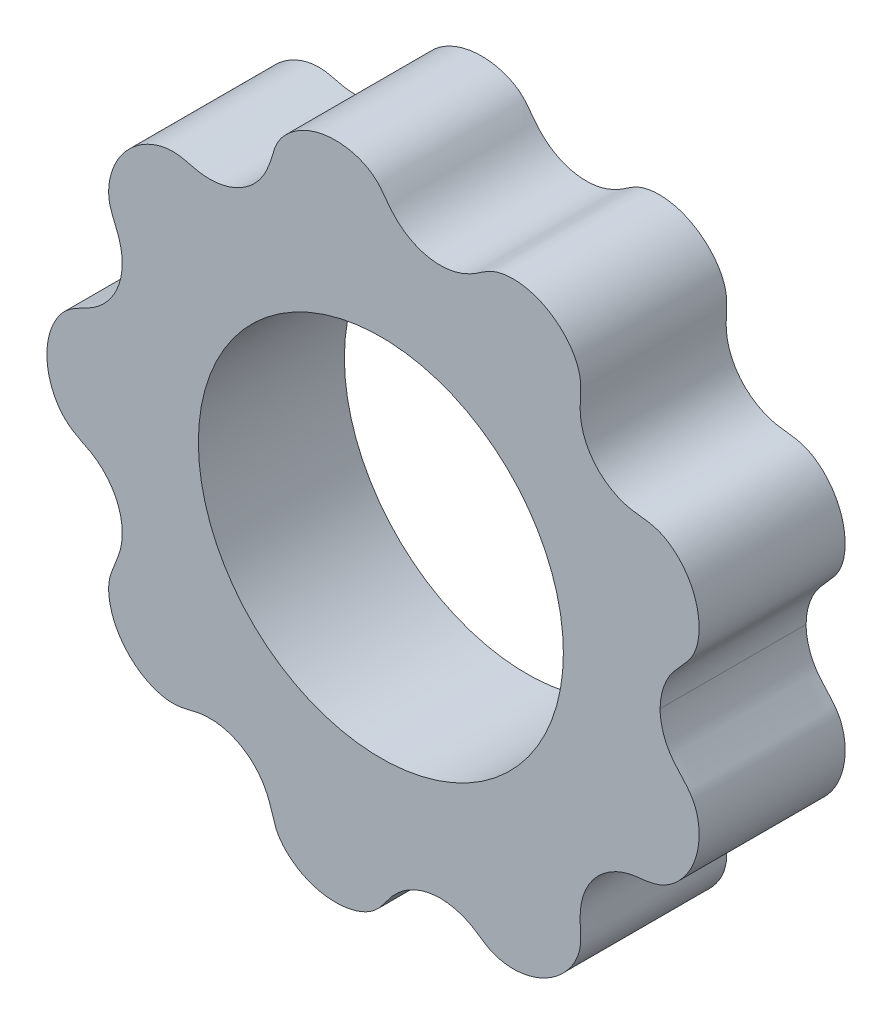
ISO-10303-21;
HEADER;
FILE_DESCRIPTION(('STEP AP214'),'2;1');
FILE_NAME('part.step','',(''),(''),'','','');
FILE_SCHEMA(('AUTOMOTIVE_DESIGN { 1 0 10303 214 1 1 1 1 }'));
ENDSEC;
DATA;
#1=APPLICATION_CONTEXT('core data for automotive mechanical design processes');
#2=APPLICATION_PROTOCOL_DEFINITION('international standard','automotive_design',2000,#1);
#3=PRODUCT_CONTEXT('',#1,'mechanical');
#4=PRODUCT('Part','Part','',(#3));
#5=PRODUCT_RELATED_PRODUCT_CATEGORY('part','',(#4));
#6=PRODUCT_DEFINITION_FORMATION('','',#4);
#7=PRODUCT_DEFINITION_CONTEXT('part definition',#1,'design');
#8=PRODUCT_DEFINITION('design','',#6,#7);
#9=PRODUCT_DEFINITION_SHAPE('','',#8);
#10=(LENGTH_UNIT() NAMED_UNIT(*) SI_UNIT(.MILLI.,.METRE.));
#11=(NAMED_UNIT(*) PLANE_ANGLE_UNIT() SI_UNIT($,.RADIAN.));
#12=(NAMED_UNIT(*) SI_UNIT($,.STERADIAN.) SOLID_ANGLE_UNIT());
#13=UNCERTAINTY_MEASURE_WITH_UNIT(LENGTH_MEASURE(1.E-05),#10,'distance_accuracy_value','');
#14=(GEOMETRIC_REPRESENTATION_CONTEXT(3) GLOBAL_UNCERTAINTY_ASSIGNED_CONTEXT((#13)) GLOBAL_UNIT_ASSIGNED_CONTEXT((#10,
#11,#12)) REPRESENTATION_CONTEXT('',''));
#15=CARTESIAN_POINT('',(0.,0.,0.));
#16=DIRECTION('',(0.,0.,1.));
#17=DIRECTION('',(1.,0.,0.));
#18=AXIS2_PLACEMENT_3D('',#15,#16,#17);
#19=CARTESIAN_POINT('',(-0.0640903553252776,-8.59238636273669,4.));
#20=DIRECTION('',(0.,0.,-1.));
#21=DIRECTION('',(-1.,0.,0.));
#22=AXIS2_PLACEMENT_3D('',#19,#20,#21);
#23=PLANE('',#22);
#24=CARTESIAN_POINT('',(-9.15,1.75904564940364E-13,4.));
#25=CARTESIAN_POINT('',(-9.14999999999946,-0.306988491155889,4.));
#26=CARTESIAN_POINT('',(-9.04149721913035,-0.776058476422797,4.));
#27=CARTESIAN_POINT('',(-8.68185035620893,-1.2898330715531,4.));
#28=CARTESIAN_POINT('',(-8.31406338427393,-1.53730922603503,4.));
#29=CARTESIAN_POINT('',(-7.84138127730101,-1.74614357679017,4.));
#30=CARTESIAN_POINT('',(-7.45391131920237,-2.10163305486356,4.));
#31=CARTESIAN_POINT('',(-7.18405884375142,-2.55219836299024,4.));
#32=CARTESIAN_POINT('',(-7.06582022829229,-3.06472175776117,4.));
#33=CARTESIAN_POINT('',(-7.10007935484405,-3.58820208908125,4.));
#34=CARTESIAN_POINT('',(-7.30105516571739,-4.07388172453872,4.));
#35=CARTESIAN_POINT('',(-7.47184479744046,-4.49010975642448,4.));
#36=CARTESIAN_POINT('',(-7.45713786410286,-4.95961669523273,4.));
#37=CARTESIAN_POINT('',(-7.32582467553897,-5.40663939291511,4.));
#38=CARTESIAN_POINT('',(-7.00886952394594,-5.94632531282793,4.));
#39=CARTESIAN_POINT('',(-6.51998440553316,-6.35526335254217,4.));
#40=CARTESIAN_POINT('',(-5.92495752184102,-6.55122047271209,4.));
#41=CARTESIAN_POINT('',(-5.47664751999415,-6.55331326896665,4.));
#42=CARTESIAN_POINT('',(-5.00162996144449,-6.39708431713855,4.));
#43=CARTESIAN_POINT('',(-4.29855465954171,-6.37726541531118,4.));
#44=CARTESIAN_POINT('',(-3.63884062940645,-6.67283457909535,4.));
#45=CARTESIAN_POINT('',(-3.19128084154283,-7.21116870390402,4.));
#46=CARTESIAN_POINT('',(-2.99391192732994,-7.70056927677345,4.));
#47=CARTESIAN_POINT('',(-2.8865641325213,-8.15658520955271,4.));
#48=CARTESIAN_POINT('',(-2.60166099602801,-8.52150577009893,4.));
#49=CARTESIAN_POINT('',(-2.22863728862175,-8.80196934784098,4.));
#50=CARTESIAN_POINT('',(-1.65112263145973,-9.04236063149595,4.));
#51=CARTESIAN_POINT('',(-0.855193433366989,-9.07733489740602,4.));
#52=CARTESIAN_POINT('',(-0.129230720569593,-8.75022927855712,4.));
#53=CARTESIAN_POINT('',(0.211382917722833,-8.21127940732605,4.));
#54=CARTESIAN_POINT('',(0.701116151818499,-7.70535148666352,4.));
#55=CARTESIAN_POINT('',(1.38300226514323,-7.46228648269995,4.));
#56=CARTESIAN_POINT('',(2.0782590342138,-7.54241179447265,4.));
#57=CARTESIAN_POINT('',(2.5617556306621,-7.75380190980611,4.));
#58=CARTESIAN_POINT('',(2.9459016367475,-8.05841466515576,4.));
#59=CARTESIAN_POINT('',(3.37936976621814,-8.18977753475336,4.));
#60=CARTESIAN_POINT('',(3.84801659488157,-8.19141477286762,4.));
#61=CARTESIAN_POINT('',(4.45333899473382,-8.03602254722796,4.));
#62=CARTESIAN_POINT('',(5.10666947360616,-7.58751815914681,4.));
#63=CARTESIAN_POINT('',(5.50468301476291,-6.87902711059299,4.));
#64=CARTESIAN_POINT('',(5.45724873188227,-6.26928959831478,4.));
#65=CARTESIAN_POINT('',(5.45297305677635,-5.56663333804045,4.));
#66=CARTESIAN_POINT('',(5.85843569133014,-4.75755248973668,4.));
#67=CARTESIAN_POINT('',(6.6588986774822,-4.31809107065915,4.));
#68=CARTESIAN_POINT('',(7.33829197474208,-4.28721702244148,4.));
#69=CARTESIAN_POINT('',(7.76269299991674,-4.15646550022573,4.));
#70=CARTESIAN_POINT('',(8.14066517147062,-3.87563080574887,4.));
#71=CARTESIAN_POINT('',(8.53054316099357,-3.38877947072958,4.));
#72=CARTESIAN_POINT('',(8.78310022491927,-2.63764933722536,4.));
#73=CARTESIAN_POINT('',(8.67174919740496,-1.8280306264874,4.));
#74=CARTESIAN_POINT('',(8.29727246279681,-1.36464258639138,4.));
#75=CARTESIAN_POINT('',(7.80983263734887,-0.869863779883353,4.));
#76=CARTESIAN_POINT('',(7.65000000001219,-0.340806274799314,4.));
#77=CARTESIAN_POINT('',(7.65000000000001,-3.57483470825277E-12,4.));
#78=B_SPLINE_CURVE_WITH_KNOTS('',3,(#24,#25,#26,#27,#28,#29,#30,#31,#32,#33,#34,#35,#36,#37,#38,
#39,#40,#41,#42,#43,#44,#45,#46,#47,#48,#49,#50,#51,#52,#53,#54,#55,#56,#57,#58,#59,#60,#61,#62,
#63,#64,#65,#66,#67,#68,#69,#70,#71,#72,#73,#74,#75,#76,#77),.UNSPECIFIED.,.F.,.F.,(4,1,1,1,1,1,
1,1,1,1,1,1,1,1,1,1,1,1,1,1,1,1,1,1,1,1,1,1,1,1,1,1,1,1,1,1,1,1,1,1,1,1,1,1,1,1,1,1,1,1,1,4),
(0.0660928549409997,0.0932397176020923,0.106813148932639,0.120386580263185,0.133960011593731,
0.147533442924278,0.161106874254824,0.17468030558537,0.188253736915917,0.201827168246463,
0.215400599577009,0.228974030907556,0.242547462238102,0.256120893568648,0.283267756229741,
0.296841187560287,0.310414618890833,0.32398805022138,0.337561481551926,0.364708344213019,
0.378281775543565,0.391855206874111,0.405428638204658,0.419002069535204,0.43257550086575,
0.446148932196297,0.473295794857389,0.500442657518482,0.514016088849028,0.527589520179574,
0.554736382840667,0.568309814171213,0.58188324550176,0.595456676832306,0.609030108162852,
0.622603539493399,0.636176970823945,0.663323833485038,0.69047069614613,0.704044127476677,
0.717617558807223,0.744764421468316,0.771911284129408,0.785484715459954,0.799058146790501,
0.812631578121047,0.826205009451593,0.853351872112686,0.880498734773779,0.894072166104325,
0.907645597434871,0.934792460095964),.UNSPECIFIED.);
#79=CARTESIAN_POINT('',(-9.15,-1.75904564940364E-13,4.));
#80=VERTEX_POINT('',#79);
#81=CARTESIAN_POINT('',(7.65000000000001,3.57483470825277E-12,4.));
#82=VERTEX_POINT('',#81);
#83=EDGE_CURVE('E67',#80,#82,#78,.T.);
#84=ORIENTED_EDGE('',*,*,#83,.T.);
#85=CARTESIAN_POINT('',(7.65000000000001,3.57483470825277E-12,4.));
#86=CARTESIAN_POINT('',(7.65000000001219,0.340806274799314,4.));
#87=CARTESIAN_POINT('',(7.80983263734887,0.869863779883353,4.));
#88=CARTESIAN_POINT('',(8.29727246279681,1.36464258639138,4.));
#89=CARTESIAN_POINT('',(8.67174919740496,1.8280306264874,4.));
#90=CARTESIAN_POINT('',(8.78310022491927,2.63764933722536,4.));
#91=CARTESIAN_POINT('',(8.53054316099357,3.38877947072958,4.));
#92=CARTESIAN_POINT('',(8.14066517147062,3.87563080574887,4.));
#93=CARTESIAN_POINT('',(7.76269299991674,4.15646550022573,4.));
#94=CARTESIAN_POINT('',(7.33829197474208,4.28721702244148,4.));
#95=CARTESIAN_POINT('',(6.6588986774822,4.31809107065915,4.));
#96=CARTESIAN_POINT('',(5.85843569133014,4.75755248973668,4.));
#97=CARTESIAN_POINT('',(5.45297305677635,5.56663333804045,4.));
#98=CARTESIAN_POINT('',(5.45724873188227,6.26928959831478,4.));
#99=CARTESIAN_POINT('',(5.50468301476291,6.87902711059299,4.));
#100=CARTESIAN_POINT('',(5.10666947360616,7.58751815914681,4.));
#101=CARTESIAN_POINT('',(4.45333899473382,8.03602254722796,4.));
#102=CARTESIAN_POINT('',(3.84801659488157,8.19141477286762,4.));
#103=CARTESIAN_POINT('',(3.37936976621814,8.18977753475336,4.));
#104=CARTESIAN_POINT('',(2.9459016367475,8.05841466515576,4.));
#105=CARTESIAN_POINT('',(2.5617556306621,7.75380190980611,4.));
#106=CARTESIAN_POINT('',(2.0782590342138,7.54241179447265,4.));
#107=CARTESIAN_POINT('',(1.38300226514323,7.46228648269995,4.));
#108=CARTESIAN_POINT('',(0.701116151818499,7.70535148666352,4.));
#109=CARTESIAN_POINT('',(0.211382917722833,8.21127940732605,4.));
#110=CARTESIAN_POINT('',(-0.129230720569593,8.75022927855712,4.));
#111=CARTESIAN_POINT('',(-0.855193433366989,9.07733489740602,4.));
#112=CARTESIAN_POINT('',(-1.65112263145973,9.04236063149595,4.));
#113=CARTESIAN_POINT('',(-2.22863728862175,8.80196934784098,4.));
#114=CARTESIAN_POINT('',(-2.60166099602801,8.52150577009893,4.));
#115=CARTESIAN_POINT('',(-2.8865641325213,8.15658520955271,4.));
#116=CARTESIAN_POINT('',(-2.99391192732994,7.70056927677345,4.));
#117=CARTESIAN_POINT('',(-3.19128084154283,7.21116870390402,4.));
#118=CARTESIAN_POINT('',(-3.63884062940645,6.67283457909535,4.));
#119=CARTESIAN_POINT('',(-4.29855465954171,6.37726541531118,4.));
#120=CARTESIAN_POINT('',(-5.00162996144449,6.39708431713855,4.));
#121=CARTESIAN_POINT('',(-5.47664751999415,6.55331326896665,4.));
#122=CARTESIAN_POINT('',(-5.92495752184102,6.55122047271209,4.));
#123=CARTESIAN_POINT('',(-6.51998440553316,6.35526335254217,4.));
#124=CARTESIAN_POINT('',(-7.00886952394594,5.94632531282793,4.));
#125=CARTESIAN_POINT('',(-7.32582467553897,5.40663939291511,4.));
#126=CARTESIAN_POINT('',(-7.45713786410286,4.95961669523273,4.));
#127=CARTESIAN_POINT('',(-7.47184479744046,4.49010975642448,4.));
#128=CARTESIAN_POINT('',(-7.30105516571739,4.07388172453872,4.));
#129=CARTESIAN_POINT('',(-7.10007935484405,3.58820208908125,4.));
#130=CARTESIAN_POINT('',(-7.06582022829229,3.06472175776117,4.));
#131=CARTESIAN_POINT('',(-7.18405884375142,2.55219836299024,4.));
#132=CARTESIAN_POINT('',(-7.45391131920237,2.10163305486356,4.));
#133=CARTESIAN_POINT('',(-7.84138127730101,1.74614357679017,4.));
#134=CARTESIAN_POINT('',(-8.31406338427393,1.53730922603503,4.));
#135=CARTESIAN_POINT('',(-8.68185035620893,1.2898330715531,4.));
#136=CARTESIAN_POINT('',(-9.04149721913035,0.776058476422797,4.));
#137=CARTESIAN_POINT('',(-9.14999999999946,0.306988491155889,4.));
#138=CARTESIAN_POINT('',(-9.15,-1.75904564940364E-13,4.));
#139=B_SPLINE_CURVE_WITH_KNOTS('',3,(#85,#86,#87,#88,#89,#90,#91,#92,#93,#94,#95,#96,#97,#98,
#99,#100,#101,#102,#103,#104,#105,#106,#107,#108,#109,#110,#111,#112,#113,#114,#115,#116,#117,
#118,#119,#120,#121,#122,#123,#124,#125,#126,#127,#128,#129,#130,#131,#132,#133,#134,#135,#136,
#137,#138),.UNSPECIFIED.,.F.,.F.,(4,1,1,1,1,1,1,1,1,1,1,1,1,1,1,1,1,1,1,1,1,1,1,1,1,1,1,1,1,1,1,
1,1,1,1,1,1,1,1,1,1,1,1,1,1,1,1,1,1,1,1,4),(0.0660928549409997,0.0932397176020923,
0.106813148932639,0.120386580263185,0.147533442924278,0.17468030558537,0.188253736915917,
0.201827168246463,0.215400599577009,0.228974030907555,0.256120893568648,0.283267756229741,
0.296841187560287,0.310414618890833,0.337561481551926,0.364708344213019,0.378281775543565,
0.391855206874111,0.405428638204658,0.419002069535204,0.43257550086575,0.446148932196297,
0.473295794857389,0.486869226187935,0.500442657518482,0.527589520179574,0.554736382840667,
0.568309814171213,0.58188324550176,0.595456676832306,0.609030108162852,0.622603539493399,
0.636176970823945,0.663323833485038,0.676897264815584,0.69047069614613,0.704044127476677,
0.717617558807223,0.744764421468316,0.758337852798862,0.771911284129408,0.785484715459954,
0.799058146790501,0.812631578121047,0.826205009451593,0.83977844078214,0.853351872112686,
0.866925303443232,0.880498734773779,0.894072166104325,0.907645597434871,0.934792460095964),.UNSPECIFIED.);
#140=EDGE_CURVE('E52',#82,#80,#139,.T.);
#141=ORIENTED_EDGE('',*,*,#140,.T.);
#142=EDGE_LOOP('',(#84,#141));
#143=FACE_BOUND('',#142,.T.);
#144=CARTESIAN_POINT('',(0.,0.,4.));
#145=DIRECTION('',(0.,0.,1.));
#146=DIRECTION('',(1.,0.,0.));
#147=AXIS2_PLACEMENT_3D('',#144,#145,#146);
#148=CIRCLE('',#147,5.);
#149=CARTESIAN_POINT('',(5.,0.,4.));
#150=VERTEX_POINT('',#149);
#151=EDGE_CURVE('E73',#150,#150,#148,.T.);
#152=ORIENTED_EDGE('',*,*,#151,.F.);
#153=EDGE_LOOP('',(#152));
#154=FACE_BOUND('',#153,.T.);
#155=ADVANCED_FACE('F35',(#143,#154),#23,.F.);
#156=CARTESIAN_POINT('',(-0.0640903553252776,-8.59238636273669,0.));
#157=DIRECTION('',(0.,0.,-1.));
#158=DIRECTION('',(-1.,0.,0.));
#159=AXIS2_PLACEMENT_3D('',#156,#157,#158);
#160=PLANE('',#159);
#161=CARTESIAN_POINT('',(-9.15,1.75904564940364E-13,0.));
#162=CARTESIAN_POINT('',(-9.14999999999946,-0.306988491155889,0.));
#163=CARTESIAN_POINT('',(-9.04149721913035,-0.776058476422797,0.));
#164=CARTESIAN_POINT('',(-8.68185035620893,-1.2898330715531,0.));
#165=CARTESIAN_POINT('',(-8.31406338427393,-1.53730922603503,0.));
#166=CARTESIAN_POINT('',(-7.84138127730101,-1.74614357679017,0.));
#167=CARTESIAN_POINT('',(-7.45391131920237,-2.10163305486356,0.));
#168=CARTESIAN_POINT('',(-7.18405884375142,-2.55219836299024,0.));
#169=CARTESIAN_POINT('',(-7.06582022829229,-3.06472175776117,0.));
#170=CARTESIAN_POINT('',(-7.10007935484405,-3.58820208908125,0.));
#171=CARTESIAN_POINT('',(-7.30105516571739,-4.07388172453872,0.));
#172=CARTESIAN_POINT('',(-7.47184479744046,-4.49010975642448,0.));
#173=CARTESIAN_POINT('',(-7.45713786410286,-4.95961669523273,0.));
#174=CARTESIAN_POINT('',(-7.32582467553897,-5.40663939291511,0.));
#175=CARTESIAN_POINT('',(-7.00886952394594,-5.94632531282793,0.));
#176=CARTESIAN_POINT('',(-6.51998440553316,-6.35526335254217,0.));
#177=CARTESIAN_POINT('',(-5.92495752184102,-6.55122047271209,0.));
#178=CARTESIAN_POINT('',(-5.47664751999415,-6.55331326896665,0.));
#179=CARTESIAN_POINT('',(-5.00162996144449,-6.39708431713855,0.));
#180=CARTESIAN_POINT('',(-4.29855465954171,-6.37726541531118,0.));
#181=CARTESIAN_POINT('',(-3.63884062940645,-6.67283457909535,0.));
#182=CARTESIAN_POINT('',(-3.19128084154283,-7.21116870390402,0.));
#183=CARTESIAN_POINT('',(-2.99391192732994,-7.70056927677345,0.));
#184=CARTESIAN_POINT('',(-2.8865641325213,-8.15658520955271,0.));
#185=CARTESIAN_POINT('',(-2.60166099602801,-8.52150577009893,0.));
#186=CARTESIAN_POINT('',(-2.22863728862175,-8.80196934784098,0.));
#187=CARTESIAN_POINT('',(-1.65112263145973,-9.04236063149595,0.));
#188=CARTESIAN_POINT('',(-0.855193433366989,-9.07733489740602,0.));
#189=CARTESIAN_POINT('',(-0.129230720569593,-8.75022927855712,0.));
#190=CARTESIAN_POINT('',(0.211382917722833,-8.21127940732605,0.));
#191=CARTESIAN_POINT('',(0.701116151818499,-7.70535148666352,0.));
#192=CARTESIAN_POINT('',(1.38300226514323,-7.46228648269995,0.));
#193=CARTESIAN_POINT('',(2.0782590342138,-7.54241179447265,0.));
#194=CARTESIAN_POINT('',(2.5617556306621,-7.75380190980611,0.));
#195=CARTESIAN_POINT('',(2.9459016367475,-8.05841466515576,0.));
#196=CARTESIAN_POINT('',(3.37936976621814,-8.18977753475336,0.));
#197=CARTESIAN_POINT('',(3.84801659488157,-8.19141477286762,0.));
#198=CARTESIAN_POINT('',(4.45333899473382,-8.03602254722796,0.));
#199=CARTESIAN_POINT('',(5.10666947360616,-7.58751815914681,0.));
#200=CARTESIAN_POINT('',(5.50468301476291,-6.87902711059299,0.));
#201=CARTESIAN_POINT('',(5.45724873188227,-6.26928959831478,0.));
#202=CARTESIAN_POINT('',(5.45297305677635,-5.56663333804045,0.));
#203=CARTESIAN_POINT('',(5.85843569133014,-4.75755248973668,0.));
#204=CARTESIAN_POINT('',(6.6588986774822,-4.31809107065915,0.));
#205=CARTESIAN_POINT('',(7.33829197474208,-4.28721702244148,0.));
#206=CARTESIAN_POINT('',(7.76269299991674,-4.15646550022573,0.));
#207=CARTESIAN_POINT('',(8.14066517147062,-3.87563080574887,0.));
#208=CARTESIAN_POINT('',(8.53054316099357,-3.38877947072958,0.));
#209=CARTESIAN_POINT('',(8.78310022491927,-2.63764933722536,0.));
#210=CARTESIAN_POINT('',(8.67174919740496,-1.8280306264874,0.));
#211=CARTESIAN_POINT('',(8.29727246279681,-1.36464258639138,0.));
#212=CARTESIAN_POINT('',(7.80983263734887,-0.869863779883353,0.));
#213=CARTESIAN_POINT('',(7.65000000001219,-0.340806274799314,0.));
#214=CARTESIAN_POINT('',(7.65000000000001,-3.57483470825277E-12,0.));
#215=B_SPLINE_CURVE_WITH_KNOTS('',3,(#161,#162,#163,#164,#165,#166,#167,#168,#169,#170,#171,
#172,#173,#174,#175,#176,#177,#178,#179,#180,#181,#182,#183,#184,#185,#186,#187,#188,#189,#190,
#191,#192,#193,#194,#195,#196,#197,#198,#199,#200,#201,#202,#203,#204,#205,#206,#207,#208,#209,
#210,#211,#212,#213,#214),.UNSPECIFIED.,.F.,.F.,(4,1,1,1,1,1,1,1,1,1,1,1,1,1,1,1,1,1,1,1,1,1,1,
1,1,1,1,1,1,1,1,1,1,1,1,1,1,1,1,1,1,1,1,1,1,1,1,1,1,1,1,4),(0.0660928549409997,
0.0932397176020923,0.106813148932639,0.120386580263185,0.133960011593731,0.147533442924278,
0.161106874254824,0.17468030558537,0.188253736915917,0.201827168246463,0.215400599577009,
0.228974030907556,0.242547462238102,0.256120893568648,0.283267756229741,0.296841187560287,
0.310414618890833,0.32398805022138,0.337561481551926,0.364708344213019,0.378281775543565,
0.391855206874111,0.405428638204658,0.419002069535204,0.43257550086575,0.446148932196297,
0.473295794857389,0.500442657518482,0.514016088849028,0.527589520179574,0.554736382840667,
0.568309814171213,0.58188324550176,0.595456676832306,0.609030108162852,0.622603539493399,
0.636176970823945,0.663323833485038,0.69047069614613,0.704044127476677,0.717617558807223,
0.744764421468316,0.771911284129408,0.785484715459954,0.799058146790501,0.812631578121047,
0.826205009451593,0.853351872112686,0.880498734773779,0.894072166104325,0.907645597434871,
0.934792460095964),.UNSPECIFIED.);
#216=CARTESIAN_POINT('',(-9.15,-1.75904564940364E-13,0.));
#217=VERTEX_POINT('',#216);
#218=CARTESIAN_POINT('',(7.65000000000001,3.57483470825277E-12,0.));
#219=VERTEX_POINT('',#218);
#220=EDGE_CURVE('E68',#217,#219,#215,.T.);
#221=ORIENTED_EDGE('',*,*,#220,.F.);
#222=CARTESIAN_POINT('',(7.65000000000001,3.57483470825277E-12,0.));
#223=CARTESIAN_POINT('',(7.65000000001219,0.340806274799314,0.));
#224=CARTESIAN_POINT('',(7.80983263734887,0.869863779883353,0.));
#225=CARTESIAN_POINT('',(8.29727246279681,1.36464258639138,0.));
#226=CARTESIAN_POINT('',(8.67174919740496,1.8280306264874,0.));
#227=CARTESIAN_POINT('',(8.78310022491927,2.63764933722536,0.));
#228=CARTESIAN_POINT('',(8.53054316099357,3.38877947072958,0.));
#229=CARTESIAN_POINT('',(8.14066517147062,3.87563080574887,0.));
#230=CARTESIAN_POINT('',(7.76269299991674,4.15646550022573,0.));
#231=CARTESIAN_POINT('',(7.33829197474208,4.28721702244148,0.));
#232=CARTESIAN_POINT('',(6.6588986774822,4.31809107065915,0.));
#233=CARTESIAN_POINT('',(5.85843569133014,4.75755248973668,0.));
#234=CARTESIAN_POINT('',(5.45297305677635,5.56663333804045,0.));
#235=CARTESIAN_POINT('',(5.45724873188227,6.26928959831478,0.));
#236=CARTESIAN_POINT('',(5.50468301476291,6.87902711059299,0.));
#237=CARTESIAN_POINT('',(5.10666947360616,7.58751815914681,0.));
#238=CARTESIAN_POINT('',(4.45333899473382,8.03602254722796,0.));
#239=CARTESIAN_POINT('',(3.84801659488157,8.19141477286762,0.));
#240=CARTESIAN_POINT('',(3.37936976621814,8.18977753475336,0.));
#241=CARTESIAN_POINT('',(2.9459016367475,8.05841466515576,0.));
#242=CARTESIAN_POINT('',(2.5617556306621,7.75380190980611,0.));
#243=CARTESIAN_POINT('',(2.0782590342138,7.54241179447265,0.));
#244=CARTESIAN_POINT('',(1.38300226514323,7.46228648269995,0.));
#245=CARTESIAN_POINT('',(0.701116151818499,7.70535148666352,0.));
#246=CARTESIAN_POINT('',(0.211382917722833,8.21127940732605,0.));
#247=CARTESIAN_POINT('',(-0.129230720569593,8.75022927855712,0.));
#248=CARTESIAN_POINT('',(-0.855193433366989,9.07733489740602,0.));
#249=CARTESIAN_POINT('',(-1.65112263145973,9.04236063149595,0.));
#250=CARTESIAN_POINT('',(-2.22863728862175,8.80196934784098,0.));
#251=CARTESIAN_POINT('',(-2.60166099602801,8.52150577009893,0.));
#252=CARTESIAN_POINT('',(-2.8865641325213,8.15658520955271,0.));
#253=CARTESIAN_POINT('',(-2.99391192732994,7.70056927677345,0.));
#254=CARTESIAN_POINT('',(-3.19128084154283,7.21116870390402,0.));
#255=CARTESIAN_POINT('',(-3.63884062940645,6.67283457909535,0.));
#256=CARTESIAN_POINT('',(-4.29855465954171,6.37726541531118,0.));
#257=CARTESIAN_POINT('',(-5.00162996144449,6.39708431713855,0.));
#258=CARTESIAN_POINT('',(-5.47664751999415,6.55331326896665,0.));
#259=CARTESIAN_POINT('',(-5.92495752184102,6.55122047271209,0.));
#260=CARTESIAN_POINT('',(-6.51998440553316,6.35526335254217,0.));
#261=CARTESIAN_POINT('',(-7.00886952394594,5.94632531282793,0.));
#262=CARTESIAN_POINT('',(-7.32582467553897,5.40663939291511,0.));
#263=CARTESIAN_POINT('',(-7.45713786410286,4.95961669523273,0.));
#264=CARTESIAN_POINT('',(-7.47184479744046,4.49010975642448,0.));
#265=CARTESIAN_POINT('',(-7.30105516571739,4.07388172453872,0.));
#266=CARTESIAN_POINT('',(-7.10007935484405,3.58820208908125,0.));
#267=CARTESIAN_POINT('',(-7.06582022829229,3.06472175776117,0.));
#268=CARTESIAN_POINT('',(-7.18405884375142,2.55219836299024,0.));
#269=CARTESIAN_POINT('',(-7.45391131920237,2.10163305486356,0.));
#270=CARTESIAN_POINT('',(-7.84138127730101,1.74614357679017,0.));
#271=CARTESIAN_POINT('',(-8.31406338427393,1.53730922603503,0.));
#272=CARTESIAN_POINT('',(-8.68185035620893,1.2898330715531,0.));
#273=CARTESIAN_POINT('',(-9.04149721913035,0.776058476422797,0.));
#274=CARTESIAN_POINT('',(-9.14999999999946,0.306988491155889,0.));
#275=CARTESIAN_POINT('',(-9.15,-1.75904564940364E-13,0.));
#276=B_SPLINE_CURVE_WITH_KNOTS('',3,(#222,#223,#224,#225,#226,#227,#228,#229,#230,#231,#232,
#233,#234,#235,#236,#237,#238,#239,#240,#241,#242,#243,#244,#245,#246,#247,#248,#249,#250,#251,
#252,#253,#254,#255,#256,#257,#258,#259,#260,#261,#262,#263,#264,#265,#266,#267,#268,#269,#270,
#271,#272,#273,#274,#275),.UNSPECIFIED.,.F.,.F.,(4,1,1,1,1,1,1,1,1,1,1,1,1,1,1,1,1,1,1,1,1,1,1,
1,1,1,1,1,1,1,1,1,1,1,1,1,1,1,1,1,1,1,1,1,1,1,1,1,1,1,1,4),(0.0660928549409997,
0.0932397176020923,0.106813148932639,0.120386580263185,0.147533442924278,0.17468030558537,
0.188253736915917,0.201827168246463,0.215400599577009,0.228974030907555,0.256120893568648,
0.283267756229741,0.296841187560287,0.310414618890833,0.337561481551926,0.364708344213019,
0.378281775543565,0.391855206874111,0.405428638204658,0.419002069535204,0.43257550086575,
0.446148932196297,0.473295794857389,0.486869226187935,0.500442657518482,0.527589520179574,
0.554736382840667,0.568309814171213,0.58188324550176,0.595456676832306,0.609030108162852,
0.622603539493399,0.636176970823945,0.663323833485038,0.676897264815584,0.69047069614613,
0.704044127476677,0.717617558807223,0.744764421468316,0.758337852798862,0.771911284129408,
0.785484715459954,0.799058146790501,0.812631578121047,0.826205009451593,0.83977844078214,
0.853351872112686,0.866925303443232,0.880498734773779,0.894072166104325,0.907645597434871,
0.934792460095964),.UNSPECIFIED.);
#277=EDGE_CURVE('E60',#219,#217,#276,.T.);
#278=ORIENTED_EDGE('',*,*,#277,.F.);
#279=EDGE_LOOP('',(#221,#278));
#280=FACE_BOUND('',#279,.T.);
#281=CARTESIAN_POINT('',(0.,0.,0.));
#282=DIRECTION('',(0.,0.,1.));
#283=DIRECTION('',(1.,0.,0.));
#284=AXIS2_PLACEMENT_3D('',#281,#282,#283);
#285=CIRCLE('',#284,5.);
#286=CARTESIAN_POINT('',(5.,0.,0.));
#287=VERTEX_POINT('',#286);
#288=EDGE_CURVE('E76',#287,#287,#285,.T.);
#289=ORIENTED_EDGE('',*,*,#288,.T.);
#290=EDGE_LOOP('',(#289));
#291=FACE_BOUND('',#290,.T.);
#292=ADVANCED_FACE('F71',(#280,#291),#160,.T.);
#293=DIRECTION('',(0.,0.,-1.));
#294=VECTOR('',#293,1.);
#295=SURFACE_OF_LINEAR_EXTRUSION('',#78,#294);
#296=ORIENTED_EDGE('',*,*,#220,.T.);
#297=DIRECTION('',(0.,0.,-1.));
#298=VECTOR('',#297,1.);
#299=CARTESIAN_POINT('',(7.65000000000001,3.57483470825277E-12,4.));
#300=LINE('',#299,#298);
#301=EDGE_CURVE('E11',#82,#219,#300,.T.);
#302=ORIENTED_EDGE('',*,*,#301,.F.);
#303=ORIENTED_EDGE('',*,*,#83,.F.);
#304=DIRECTION('',(0.,0.,-1.));
#305=VECTOR('',#304,1.);
#306=CARTESIAN_POINT('',(-9.15,-1.75904564940364E-13,4.));
#307=LINE('',#306,#305);
#308=EDGE_CURVE('E45',#80,#217,#307,.T.);
#309=ORIENTED_EDGE('',*,*,#308,.T.);
#310=EDGE_LOOP('',(#296,#302,#303,#309));
#311=FACE_BOUND('',#310,.T.);
#312=ADVANCED_FACE('F37',(#311),#295,.F.);
#313=DIRECTION('',(0.,0.,-1.));
#314=VECTOR('',#313,1.);
#315=SURFACE_OF_LINEAR_EXTRUSION('',#139,#314);
#316=ORIENTED_EDGE('',*,*,#277,.T.);
#317=ORIENTED_EDGE('',*,*,#308,.F.);
#318=ORIENTED_EDGE('',*,*,#140,.F.);
#319=ORIENTED_EDGE('',*,*,#301,.T.);
#320=EDGE_LOOP('',(#316,#317,#318,#319));
#321=FACE_BOUND('',#320,.T.);
#322=ADVANCED_FACE('F63',(#321),#315,.F.);
#323=CARTESIAN_POINT('',(0.,0.,4.));
#324=DIRECTION('',(0.,0.,-1.));
#325=DIRECTION('',(-1.,0.,0.));
#326=AXIS2_PLACEMENT_3D('',#323,#324,#325);
#327=CYLINDRICAL_SURFACE('',#326,5.);
#328=ORIENTED_EDGE('',*,*,#151,.T.);
#329=EDGE_LOOP('',(#328));
#330=FACE_BOUND('',#329,.T.);
#331=ORIENTED_EDGE('',*,*,#288,.F.);
#332=EDGE_LOOP('',(#331));
#333=FACE_BOUND('',#332,.T.);
#334=ADVANCED_FACE('F101',(#330,#333),#327,.F.);
#335=CLOSED_SHELL('',(#155,#292,#312,#322,#334));
#336=MANIFOLD_SOLID_BREP('B2',#335);
#337=ADVANCED_BREP_SHAPE_REPRESENTATION('',(#18,#336),#14);
#338=SHAPE_DEFINITION_REPRESENTATION(#9,#337);
ENDSEC;
END-ISO-10303-21;
